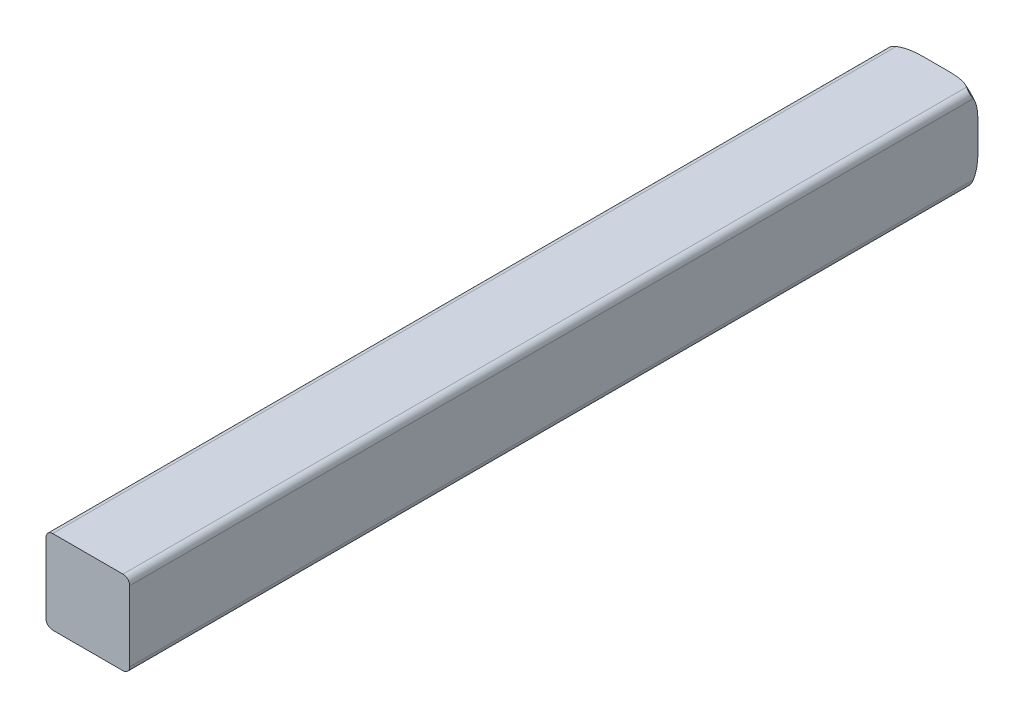
ISO-10303-21;
HEADER;
FILE_DESCRIPTION(('STEP AP214'),'2;1');
FILE_NAME('part.step','',(''),(''),'','','');
FILE_SCHEMA(('AUTOMOTIVE_DESIGN { 1 0 10303 214 1 1 1 1 }'));
ENDSEC;
DATA;
#1=APPLICATION_CONTEXT('core data for automotive mechanical design processes');
#2=APPLICATION_PROTOCOL_DEFINITION('international standard','automotive_design',2000,#1);
#3=PRODUCT_CONTEXT('',#1,'mechanical');
#4=PRODUCT('Part','Part','',(#3));
#5=PRODUCT_RELATED_PRODUCT_CATEGORY('part','',(#4));
#6=PRODUCT_DEFINITION_FORMATION('','',#4);
#7=PRODUCT_DEFINITION_CONTEXT('part definition',#1,'design');
#8=PRODUCT_DEFINITION('design','',#6,#7);
#9=PRODUCT_DEFINITION_SHAPE('','',#8);
#10=(LENGTH_UNIT() NAMED_UNIT(*) SI_UNIT(.MILLI.,.METRE.));
#11=(NAMED_UNIT(*) PLANE_ANGLE_UNIT() SI_UNIT($,.RADIAN.));
#12=(NAMED_UNIT(*) SI_UNIT($,.STERADIAN.) SOLID_ANGLE_UNIT());
#13=UNCERTAINTY_MEASURE_WITH_UNIT(LENGTH_MEASURE(1.E-05),#10,'distance_accuracy_value','');
#14=(GEOMETRIC_REPRESENTATION_CONTEXT(3) GLOBAL_UNCERTAINTY_ASSIGNED_CONTEXT((#13)) GLOBAL_UNIT_ASSIGNED_CONTEXT((#10,
#11,#12)) REPRESENTATION_CONTEXT('',''));
#15=CARTESIAN_POINT('',(0.,0.,0.));
#16=DIRECTION('',(0.,0.,1.));
#17=DIRECTION('',(1.,0.,0.));
#18=AXIS2_PLACEMENT_3D('',#15,#16,#17);
#19=CARTESIAN_POINT('',(-1.5875,1.5875,25.4));
#20=DIRECTION('',(0.,-1.,0.));
#21=DIRECTION('',(0.,0.,-1.));
#22=AXIS2_PLACEMENT_3D('',#19,#20,#21);
#23=PLANE('',#22);
#24=DIRECTION('',(-1.,0.,0.));
#25=VECTOR('',#24,1.);
#26=CARTESIAN_POINT('',(-1.5875,1.5875,6.7818));
#27=LINE('',#26,#25);
#28=CARTESIAN_POINT('',(1.33349999999987,1.5875,6.7818));
#29=VERTEX_POINT('',#28);
#30=CARTESIAN_POINT('',(-1.3335,1.5875,6.7818));
#31=VERTEX_POINT('',#30);
#32=EDGE_CURVE('E62',#29,#31,#27,.T.);
#33=ORIENTED_EDGE('',*,*,#32,.F.);
#34=DIRECTION('',(0.,0.,-1.));
#35=VECTOR('',#34,1.);
#36=CARTESIAN_POINT('',(1.3335,1.5875,25.4));
#37=LINE('',#36,#35);
#38=CARTESIAN_POINT('',(1.33349999999974,1.58749999999969,-25.2214993180163));
#39=VERTEX_POINT('',#38);
#40=EDGE_CURVE('E656',#29,#39,#37,.T.);
#41=ORIENTED_EDGE('',*,*,#40,.T.);
#42=CARTESIAN_POINT('',(0.377876338243537,1.5875,-25.4));
#43=CARTESIAN_POINT('',(0.426955428245409,1.58750000000001,-25.3999726994332));
#44=CARTESIAN_POINT('',(0.476057594365565,1.5875,-25.3996951238186));
#45=CARTESIAN_POINT('',(0.574418921693687,1.5875,-25.3977472425544));
#46=CARTESIAN_POINT('',(0.62367796087373,1.58749999999999,-25.3960715875607));
#47=CARTESIAN_POINT('',(0.723913767631209,1.58750000000001,-25.3903168861199));
#48=CARTESIAN_POINT('',(0.774886346404213,1.58750000000003,-25.3861508441119));
#49=CARTESIAN_POINT('',(0.876340123858613,1.58749999999998,-25.3741632283405));
#50=CARTESIAN_POINT('',(0.926821985170644,1.58749999999991,-25.3663475916038));
#51=CARTESIAN_POINT('',(1.03968865381837,1.58750000000012,-25.343126894308));
#52=CARTESIAN_POINT('',(1.10179917810948,1.58750000000048,-25.3262878050471));
#53=CARTESIAN_POINT('',(1.22173099315078,1.58749999999952,-25.2821772200221));
#54=CARTESIAN_POINT('',(1.27959244956708,1.58749999999822,-25.2550243715836));
#55=CARTESIAN_POINT('',(1.36359413549268,1.58749999999892,-25.202783804209));
#56=CARTESIAN_POINT('',(1.39245604351483,1.58749999999971,-25.1820824044844));
#57=CARTESIAN_POINT('',(1.44669209107436,1.58750000000029,-25.1364313876005));
#58=CARTESIAN_POINT('',(1.4720655765244,1.58750000000007,-25.1114809756997));
#59=CARTESIAN_POINT('',(1.51404623542894,1.58749999999994,-25.0620383759476));
#60=CARTESIAN_POINT('',(1.53141043958981,1.58749999999998,-25.0381925523342));
#61=CARTESIAN_POINT('',(1.56193958694738,1.58750000000002,-24.9879886721089));
#62=CARTESIAN_POINT('',(1.57511315347299,1.5875,-24.9616359213255));
#63=CARTESIAN_POINT('',(1.59654474779821,1.5875,-24.9068641092274));
#64=CARTESIAN_POINT('',(1.60478749941619,1.5875,-24.8784389293432));
#65=CARTESIAN_POINT('',(1.61299775211399,1.5875,-24.834926317523));
#66=CARTESIAN_POINT('',(1.61504186638972,1.5875,-24.8202074707068));
#67=CARTESIAN_POINT('',(1.61768666842858,1.5875,-24.7906311075223));
#68=CARTESIAN_POINT('',(1.61828640335517,1.5875,-24.7757735061027));
#69=CARTESIAN_POINT('',(1.61815024112135,1.5875,-24.7609129315498));
#70=B_SPLINE_CURVE_WITH_KNOTS('',3,(#42,#43,#44,#45,#46,#47,#48,#49,#50,#51,#52,#53,#54,#55,#56,
#57,#58,#59,#60,#61,#62,#63,#64,#65,#66,#67,#68,#69),.UNSPECIFIED.,.F.,.F.,(4,2,2,2,2,2,2,2,2,2,
2,2,2,4),(0.,0.147273115621917,0.295112327015831,0.448445203866136,0.601529508777507,
0.793946272313836,0.984213449531073,1.09043096758095,1.19666837457899,1.28480317220881,
1.37275541843134,1.46097875740129,1.50549646351195,1.55004352928615),.UNSPECIFIED.);
#71=CARTESIAN_POINT('',(0.377876338243537,1.5875,-25.4));
#72=VERTEX_POINT('',#71);
#73=EDGE_CURVE('E166',#72,#39,#70,.T.);
#74=ORIENTED_EDGE('',*,*,#73,.F.);
#75=DIRECTION('',(-1.,0.,0.));
#76=VECTOR('',#75,1.);
#77=CARTESIAN_POINT('',(-1.5875,1.5875,-25.4));
#78=LINE('',#77,#76);
#79=CARTESIAN_POINT('',(-0.377876338243537,1.5875,-25.4));
#80=VERTEX_POINT('',#79);
#81=EDGE_CURVE('E502',#80,#72,#78,.F.);
#82=ORIENTED_EDGE('',*,*,#81,.F.);
#83=CARTESIAN_POINT('',(-1.61815024112135,1.5875,-24.7609129315495));
#84=CARTESIAN_POINT('',(-1.61827741170984,1.5875,-24.774832975681));
#85=CARTESIAN_POINT('',(-1.61775944865016,1.5875,-24.788750955823));
#86=CARTESIAN_POINT('',(-1.61545341289209,1.5875,-24.8164742175458));
#87=CARTESIAN_POINT('',(-1.61366599695527,1.5875,-24.8302795536699));
#88=CARTESIAN_POINT('',(-1.60646537302774,1.5875,-24.8711787221652));
#89=CARTESIAN_POINT('',(-1.59921496550417,1.5875,-24.8979687703741));
#90=CARTESIAN_POINT('',(-1.58026897154028,1.5875,-24.9498408303818));
#91=CARTESIAN_POINT('',(-1.56858090771092,1.5875,-24.9749256484656));
#92=CARTESIAN_POINT('',(-1.54138158394458,1.5875,-25.0229615534635));
#93=CARTESIAN_POINT('',(-1.52586349761184,1.5875,-25.0459087286724));
#94=CARTESIAN_POINT('',(-1.48463218485366,1.5875,-25.0983024519879));
#95=CARTESIAN_POINT('',(-1.45735516065407,1.5875,-25.1265196838954));
#96=CARTESIAN_POINT('',(-1.39838558325937,1.5875,-25.1778013965824));
#97=CARTESIAN_POINT('',(-1.36668795214363,1.5875,-25.2008598710605));
#98=CARTESIAN_POINT('',(-1.28789122473977,1.5875,-25.2498632222909));
#99=CARTESIAN_POINT('',(-1.23946785559753,1.5875,-25.2736585940562));
#100=CARTESIAN_POINT('',(-1.13931384582846,1.5875,-25.3136496611643));
#101=CARTESIAN_POINT('',(-1.08756118289893,1.5875,-25.3297872004526));
#102=CARTESIAN_POINT('',(-0.980703284205731,1.5875,-25.3563774958481));
#103=CARTESIAN_POINT('',(-0.92554440435982,1.5875,-25.3666051089346));
#104=CARTESIAN_POINT('',(-0.814451345157166,1.5875,-25.3822387893676));
#105=CARTESIAN_POINT('',(-0.758515488325459,1.5875,-25.3876319037079));
#106=CARTESIAN_POINT('',(-0.648312937252075,1.5875,-25.3950507769004));
#107=CARTESIAN_POINT('',(-0.594052256949161,1.5875,-25.3971820558749));
#108=CARTESIAN_POINT('',(-0.48580696984646,1.5875,-25.3996317273539));
#109=CARTESIAN_POINT('',(-0.431822645610281,1.5875,-25.3999608515369));
#110=CARTESIAN_POINT('',(-0.377876338243536,1.5875,-25.4));
#111=B_SPLINE_CURVE_WITH_KNOTS('',3,(#83,#84,#85,#86,#87,#88,#89,#90,#91,#92,#93,#94,#95,#96,
#97,#98,#99,#100,#101,#102,#103,#104,#105,#106,#107,#108,#109,#110),.UNSPECIFIED.,.F.,.F.,(4,2,
2,2,2,2,2,2,2,2,2,2,2,4),(0.,0.0417318155340758,0.0834420564934037,0.166232897913919,
0.248884016362952,0.331683524563857,0.448675775655927,0.565803539136736,0.726767186975264,
0.888934420320442,1.05692964357109,1.22537364033489,1.38824385269957,1.55014312337862),.UNSPECIFIED.);
#112=CARTESIAN_POINT('',(-1.3335,1.5875,-25.2214993180159));
#113=VERTEX_POINT('',#112);
#114=EDGE_CURVE('E337',#113,#80,#111,.T.);
#115=ORIENTED_EDGE('',*,*,#114,.F.);
#116=DIRECTION('',(0.,0.,-1.));
#117=VECTOR('',#116,1.);
#118=CARTESIAN_POINT('',(-1.3335,1.5875,25.4));
#119=LINE('',#118,#117);
#120=EDGE_CURVE('E661',#113,#31,#119,.F.);
#121=ORIENTED_EDGE('',*,*,#120,.T.);
#122=EDGE_LOOP('',(#33,#41,#74,#82,#115,#121));
#123=FACE_BOUND('',#122,.T.);
#124=ADVANCED_FACE('F46',(#123),#23,.F.);
#125=CARTESIAN_POINT('',(1.5875,-1.5875,25.4));
#126=DIRECTION('',(-1.,0.,0.));
#127=DIRECTION('',(0.,0.,1.));
#128=AXIS2_PLACEMENT_3D('',#125,#126,#127);
#129=PLANE('',#128);
#130=DIRECTION('',(0.,1.,0.));
#131=VECTOR('',#130,1.);
#132=CARTESIAN_POINT('',(1.5875,-1.5875,6.7818));
#133=LINE('',#132,#131);
#134=CARTESIAN_POINT('',(1.5875,-1.33349999999987,6.7818));
#135=VERTEX_POINT('',#134);
#136=CARTESIAN_POINT('',(1.5875,1.3335,6.7818));
#137=VERTEX_POINT('',#136);
#138=EDGE_CURVE('E355',#135,#137,#133,.T.);
#139=ORIENTED_EDGE('',*,*,#138,.F.);
#140=DIRECTION('',(0.,0.,-1.));
#141=VECTOR('',#140,1.);
#142=CARTESIAN_POINT('',(1.5875,-1.3335,25.4));
#143=LINE('',#142,#141);
#144=CARTESIAN_POINT('',(1.58749999999969,-1.33349999999974,-25.2214993180163));
#145=VERTEX_POINT('',#144);
#146=EDGE_CURVE('E688',#135,#145,#143,.T.);
#147=ORIENTED_EDGE('',*,*,#146,.T.);
#148=CARTESIAN_POINT('',(1.5875,-0.377876338243537,-25.4));
#149=CARTESIAN_POINT('',(1.58750000000001,-0.426955428245409,-25.3999726994332));
#150=CARTESIAN_POINT('',(1.5875,-0.476057594365565,-25.3996951238186));
#151=CARTESIAN_POINT('',(1.5875,-0.574418921693687,-25.3977472425544));
#152=CARTESIAN_POINT('',(1.58749999999999,-0.62367796087373,-25.3960715875607));
#153=CARTESIAN_POINT('',(1.58750000000001,-0.723913767631209,-25.3903168861199));
#154=CARTESIAN_POINT('',(1.58750000000003,-0.774886346404213,-25.3861508441119));
#155=CARTESIAN_POINT('',(1.58749999999998,-0.876340123858612,-25.3741632283405));
#156=CARTESIAN_POINT('',(1.58749999999991,-0.926821985170644,-25.3663475916038));
#157=CARTESIAN_POINT('',(1.58750000000012,-1.03968865381837,-25.343126894308));
#158=CARTESIAN_POINT('',(1.58750000000048,-1.10179917810948,-25.3262878050471));
#159=CARTESIAN_POINT('',(1.58749999999952,-1.22173099315078,-25.2821772200221));
#160=CARTESIAN_POINT('',(1.58749999999822,-1.27959244956708,-25.2550243715836));
#161=CARTESIAN_POINT('',(1.58749999999892,-1.36359413549268,-25.202783804209));
#162=CARTESIAN_POINT('',(1.58749999999971,-1.39245604351483,-25.1820824044844));
#163=CARTESIAN_POINT('',(1.58750000000029,-1.44669209107436,-25.1364313876005));
#164=CARTESIAN_POINT('',(1.58750000000007,-1.4720655765244,-25.1114809756997));
#165=CARTESIAN_POINT('',(1.58749999999994,-1.51404623542894,-25.0620383759476));
#166=CARTESIAN_POINT('',(1.58749999999998,-1.53141043958981,-25.0381925523342));
#167=CARTESIAN_POINT('',(1.58750000000002,-1.56193958694738,-24.9879886721089));
#168=CARTESIAN_POINT('',(1.5875,-1.57511315347299,-24.9616359213255));
#169=CARTESIAN_POINT('',(1.5875,-1.59654474779821,-24.9068641092274));
#170=CARTESIAN_POINT('',(1.5875,-1.60478749941619,-24.8784389293432));
#171=CARTESIAN_POINT('',(1.5875,-1.61299775211399,-24.834926317523));
#172=CARTESIAN_POINT('',(1.5875,-1.61504186638972,-24.8202074707068));
#173=CARTESIAN_POINT('',(1.5875,-1.61768666842858,-24.7906311075223));
#174=CARTESIAN_POINT('',(1.5875,-1.61828640335517,-24.7757735061027));
#175=CARTESIAN_POINT('',(1.5875,-1.61815024112135,-24.7609129315498));
#176=B_SPLINE_CURVE_WITH_KNOTS('',3,(#148,#149,#150,#151,#152,#153,#154,#155,#156,#157,#158,
#159,#160,#161,#162,#163,#164,#165,#166,#167,#168,#169,#170,#171,#172,#173,#174,#175),
.UNSPECIFIED.,.F.,.F.,(4,2,2,2,2,2,2,2,2,2,2,2,2,4),(0.,0.147273115621916,0.295112327015831,
0.448445203866135,0.601529508777506,0.793946272313837,0.984213449531074,1.09043096758095,
1.19666837457899,1.28480317220881,1.37275541843134,1.46097875740129,1.50549646351195,
1.55004352928615),.UNSPECIFIED.);
#177=CARTESIAN_POINT('',(1.5875,-0.377876338243537,-25.4));
#178=VERTEX_POINT('',#177);
#179=EDGE_CURVE('E347',#178,#145,#176,.T.);
#180=ORIENTED_EDGE('',*,*,#179,.F.);
#181=DIRECTION('',(0.,1.,0.));
#182=VECTOR('',#181,1.);
#183=CARTESIAN_POINT('',(1.5875,1.5875,-25.4));
#184=LINE('',#183,#182);
#185=CARTESIAN_POINT('',(1.5875,0.377876338243537,-25.4));
#186=VERTEX_POINT('',#185);
#187=EDGE_CURVE('E486',#186,#178,#184,.F.);
#188=ORIENTED_EDGE('',*,*,#187,.F.);
#189=CARTESIAN_POINT('',(1.5875,1.61815024112135,-24.7609129315495));
#190=CARTESIAN_POINT('',(1.5875,1.61827741170984,-24.774832975681));
#191=CARTESIAN_POINT('',(1.5875,1.61775944865016,-24.788750955823));
#192=CARTESIAN_POINT('',(1.5875,1.61545341289209,-24.8164742175458));
#193=CARTESIAN_POINT('',(1.5875,1.61366599695527,-24.8302795536699));
#194=CARTESIAN_POINT('',(1.5875,1.60646537302775,-24.8711787221652));
#195=CARTESIAN_POINT('',(1.5875,1.59921496550417,-24.8979687703741));
#196=CARTESIAN_POINT('',(1.5875,1.58026897154028,-24.9498408303818));
#197=CARTESIAN_POINT('',(1.5875,1.56858090771092,-24.9749256484656));
#198=CARTESIAN_POINT('',(1.5875,1.54138158394458,-25.0229615534635));
#199=CARTESIAN_POINT('',(1.5875,1.52586349761184,-25.0459087286724));
#200=CARTESIAN_POINT('',(1.5875,1.48463218485365,-25.0983024519879));
#201=CARTESIAN_POINT('',(1.5875,1.45735516065407,-25.1265196838954));
#202=CARTESIAN_POINT('',(1.5875,1.39838558325937,-25.1778013965824));
#203=CARTESIAN_POINT('',(1.5875,1.36668795214363,-25.2008598710605));
#204=CARTESIAN_POINT('',(1.5875,1.28789122473977,-25.2498632222909));
#205=CARTESIAN_POINT('',(1.5875,1.23946785559753,-25.2736585940562));
#206=CARTESIAN_POINT('',(1.5875,1.13931384582846,-25.3136496611643));
#207=CARTESIAN_POINT('',(1.5875,1.08756118289893,-25.3297872004526));
#208=CARTESIAN_POINT('',(1.5875,0.980703284205732,-25.3563774958481));
#209=CARTESIAN_POINT('',(1.5875,0.925544404359821,-25.3666051089346));
#210=CARTESIAN_POINT('',(1.5875,0.814451345157166,-25.3822387893676));
#211=CARTESIAN_POINT('',(1.5875,0.758515488325458,-25.3876319037079));
#212=CARTESIAN_POINT('',(1.5875,0.648312937252075,-25.3950507769004));
#213=CARTESIAN_POINT('',(1.5875,0.594052256949161,-25.3971820558749));
#214=CARTESIAN_POINT('',(1.5875,0.48580696984646,-25.3996317273539));
#215=CARTESIAN_POINT('',(1.5875,0.431822645610281,-25.3999608515369));
#216=CARTESIAN_POINT('',(1.5875,0.377876338243536,-25.4));
#217=B_SPLINE_CURVE_WITH_KNOTS('',3,(#189,#190,#191,#192,#193,#194,#195,#196,#197,#198,#199,
#200,#201,#202,#203,#204,#205,#206,#207,#208,#209,#210,#211,#212,#213,#214,#215,#216),
.UNSPECIFIED.,.F.,.F.,(4,2,2,2,2,2,2,2,2,2,2,2,2,4),(0.,0.0417318155340758,0.0834420564934036,
0.166232897913923,0.248884016362952,0.331683524563858,0.44867577565593,0.565803539136736,
0.726767186975264,0.888934420320441,1.05692964357109,1.22537364033489,1.38824385269957,
1.55014312337862),.UNSPECIFIED.);
#218=CARTESIAN_POINT('',(1.5875,1.3335,-25.2214993180159));
#219=VERTEX_POINT('',#218);
#220=EDGE_CURVE('E162',#219,#186,#217,.T.);
#221=ORIENTED_EDGE('',*,*,#220,.F.);
#222=DIRECTION('',(0.,0.,-1.));
#223=VECTOR('',#222,1.);
#224=CARTESIAN_POINT('',(1.5875,1.3335,25.4));
#225=LINE('',#224,#223);
#226=EDGE_CURVE('E151',#219,#137,#225,.F.);
#227=ORIENTED_EDGE('',*,*,#226,.T.);
#228=EDGE_LOOP('',(#139,#147,#180,#188,#221,#227));
#229=FACE_BOUND('',#228,.T.);
#230=ADVANCED_FACE('F186',(#229),#129,.F.);
#231=CARTESIAN_POINT('',(-1.5875,-1.5875,25.4));
#232=DIRECTION('',(1.,0.,0.));
#233=DIRECTION('',(0.,0.,-1.));
#234=AXIS2_PLACEMENT_3D('',#231,#232,#233);
#235=PLANE('',#234);
#236=DIRECTION('',(0.,-1.,0.));
#237=VECTOR('',#236,1.);
#238=CARTESIAN_POINT('',(-1.5875,-1.5875,6.7818));
#239=LINE('',#238,#237);
#240=CARTESIAN_POINT('',(-1.5875,1.33349999999987,6.7818));
#241=VERTEX_POINT('',#240);
#242=CARTESIAN_POINT('',(-1.5875,-1.33349999999987,6.7818));
#243=VERTEX_POINT('',#242);
#244=EDGE_CURVE('E134',#241,#243,#239,.T.);
#245=ORIENTED_EDGE('',*,*,#244,.F.);
#246=DIRECTION('',(0.,0.,-1.));
#247=VECTOR('',#246,1.);
#248=CARTESIAN_POINT('',(-1.5875,1.3335,25.4));
#249=LINE('',#248,#247);
#250=CARTESIAN_POINT('',(-1.58749999999969,1.33349999999974,-25.2214993180163));
#251=VERTEX_POINT('',#250);
#252=EDGE_CURVE('E144',#241,#251,#249,.T.);
#253=ORIENTED_EDGE('',*,*,#252,.T.);
#254=CARTESIAN_POINT('',(-1.5875,0.377876338243537,-25.4));
#255=CARTESIAN_POINT('',(-1.58750000000001,0.426955428245409,-25.3999726994332));
#256=CARTESIAN_POINT('',(-1.5875,0.476057594365566,-25.3996951238186));
#257=CARTESIAN_POINT('',(-1.5875,0.574418921693688,-25.3977472425544));
#258=CARTESIAN_POINT('',(-1.58749999999999,0.623677960873731,-25.3960715875607));
#259=CARTESIAN_POINT('',(-1.58750000000001,0.72391376763121,-25.3903168861199));
#260=CARTESIAN_POINT('',(-1.58750000000003,0.774886346404214,-25.3861508441119));
#261=CARTESIAN_POINT('',(-1.58749999999998,0.876340123858614,-25.3741632283405));
#262=CARTESIAN_POINT('',(-1.58749999999991,0.926821985170646,-25.3663475916038));
#263=CARTESIAN_POINT('',(-1.58750000000012,1.03968865381837,-25.343126894308));
#264=CARTESIAN_POINT('',(-1.58750000000048,1.10179917810948,-25.3262878050471));
#265=CARTESIAN_POINT('',(-1.58749999999952,1.22173099315078,-25.2821772200221));
#266=CARTESIAN_POINT('',(-1.58749999999822,1.27959244956708,-25.2550243715836));
#267=CARTESIAN_POINT('',(-1.58749999999892,1.36359413549267,-25.202783804209));
#268=CARTESIAN_POINT('',(-1.58749999999971,1.39245604351483,-25.1820824044844));
#269=CARTESIAN_POINT('',(-1.58750000000029,1.44669209107436,-25.1364313876005));
#270=CARTESIAN_POINT('',(-1.58750000000007,1.4720655765244,-25.1114809756997));
#271=CARTESIAN_POINT('',(-1.58749999999994,1.51404623542894,-25.0620383759476));
#272=CARTESIAN_POINT('',(-1.58749999999998,1.53141043958981,-25.0381925523342));
#273=CARTESIAN_POINT('',(-1.58750000000002,1.56193958694738,-24.9879886721089));
#274=CARTESIAN_POINT('',(-1.5875,1.57511315347299,-24.9616359213255));
#275=CARTESIAN_POINT('',(-1.5875,1.59654474779821,-24.9068641092274));
#276=CARTESIAN_POINT('',(-1.5875,1.60478749941619,-24.8784389293432));
#277=CARTESIAN_POINT('',(-1.5875,1.61299775211399,-24.834926317523));
#278=CARTESIAN_POINT('',(-1.5875,1.61504186638972,-24.8202074707068));
#279=CARTESIAN_POINT('',(-1.5875,1.61768666842858,-24.7906311075223));
#280=CARTESIAN_POINT('',(-1.5875,1.61828640335517,-24.7757735061027));
#281=CARTESIAN_POINT('',(-1.5875,1.61815024112135,-24.7609129315498));
#282=B_SPLINE_CURVE_WITH_KNOTS('',3,(#254,#255,#256,#257,#258,#259,#260,#261,#262,#263,#264,
#265,#266,#267,#268,#269,#270,#271,#272,#273,#274,#275,#276,#277,#278,#279,#280,#281),
.UNSPECIFIED.,.F.,.F.,(4,2,2,2,2,2,2,2,2,2,2,2,2,4),(0.,0.147273115621917,0.295112327015832,
0.448445203866137,0.601529508777508,0.793946272313836,0.984213449531072,1.09043096758095,
1.19666837457899,1.28480317220881,1.37275541843134,1.46097875740129,1.50549646351195,
1.55004352928615),.UNSPECIFIED.);
#283=CARTESIAN_POINT('',(-1.5875,0.377876338243537,-25.4));
#284=VERTEX_POINT('',#283);
#285=EDGE_CURVE('E183',#284,#251,#282,.T.);
#286=ORIENTED_EDGE('',*,*,#285,.F.);
#287=DIRECTION('',(0.,1.,0.));
#288=VECTOR('',#287,1.);
#289=CARTESIAN_POINT('',(-1.5875,1.5875,-25.4));
#290=LINE('',#289,#288);
#291=CARTESIAN_POINT('',(-1.5875,-0.377876338243537,-25.4));
#292=VERTEX_POINT('',#291);
#293=EDGE_CURVE('E503',#292,#284,#290,.T.);
#294=ORIENTED_EDGE('',*,*,#293,.F.);
#295=CARTESIAN_POINT('',(-1.5875,-1.61815024112135,-24.7609129315495));
#296=CARTESIAN_POINT('',(-1.5875,-1.61827741170984,-24.774832975681));
#297=CARTESIAN_POINT('',(-1.5875,-1.61775944865016,-24.788750955823));
#298=CARTESIAN_POINT('',(-1.5875,-1.61545341289209,-24.8164742175458));
#299=CARTESIAN_POINT('',(-1.5875,-1.61366599695527,-24.8302795536699));
#300=CARTESIAN_POINT('',(-1.5875,-1.60646537302775,-24.8711787221652));
#301=CARTESIAN_POINT('',(-1.5875,-1.59921496550417,-24.8979687703741));
#302=CARTESIAN_POINT('',(-1.5875,-1.58026897154029,-24.9498408303818));
#303=CARTESIAN_POINT('',(-1.5875,-1.56858090771093,-24.9749256484655));
#304=CARTESIAN_POINT('',(-1.5875,-1.54138158394458,-25.0229615534635));
#305=CARTESIAN_POINT('',(-1.5875,-1.52586349761185,-25.0459087286724));
#306=CARTESIAN_POINT('',(-1.5875,-1.48463218485366,-25.0983024519879));
#307=CARTESIAN_POINT('',(-1.5875,-1.45735516065408,-25.1265196838954));
#308=CARTESIAN_POINT('',(-1.5875,-1.39838558325937,-25.1778013965824));
#309=CARTESIAN_POINT('',(-1.5875,-1.36668795214363,-25.2008598710605));
#310=CARTESIAN_POINT('',(-1.5875,-1.28789122473977,-25.2498632222909));
#311=CARTESIAN_POINT('',(-1.5875,-1.23946785559753,-25.2736585940562));
#312=CARTESIAN_POINT('',(-1.5875,-1.13931384582846,-25.3136496611643));
#313=CARTESIAN_POINT('',(-1.5875,-1.08756118289893,-25.3297872004526));
#314=CARTESIAN_POINT('',(-1.5875,-0.980703284205731,-25.3563774958481));
#315=CARTESIAN_POINT('',(-1.5875,-0.925544404359821,-25.3666051089346));
#316=CARTESIAN_POINT('',(-1.5875,-0.814451345157166,-25.3822387893676));
#317=CARTESIAN_POINT('',(-1.5875,-0.758515488325459,-25.3876319037079));
#318=CARTESIAN_POINT('',(-1.5875,-0.648312937252075,-25.3950507769004));
#319=CARTESIAN_POINT('',(-1.5875,-0.594052256949161,-25.3971820558749));
#320=CARTESIAN_POINT('',(-1.5875,-0.48580696984646,-25.3996317273539));
#321=CARTESIAN_POINT('',(-1.5875,-0.431822645610281,-25.3999608515369));
#322=CARTESIAN_POINT('',(-1.5875,-0.377876338243537,-25.4));
#323=B_SPLINE_CURVE_WITH_KNOTS('',3,(#295,#296,#297,#298,#299,#300,#301,#302,#303,#304,#305,
#306,#307,#308,#309,#310,#311,#312,#313,#314,#315,#316,#317,#318,#319,#320,#321,#322),
.UNSPECIFIED.,.F.,.F.,(4,2,2,2,2,2,2,2,2,2,2,2,2,4),(0.,0.0417318155340758,0.0834420564934035,
0.166232897913919,0.248884016362948,0.331683524563856,0.448675775655931,0.565803539136743,
0.726767186975271,0.888934420320449,1.0569296435711,1.2253736403349,1.38824385269958,
1.55014312337863),.UNSPECIFIED.);
#324=CARTESIAN_POINT('',(-1.5875,-1.3335,-25.2214993180159));
#325=VERTEX_POINT('',#324);
#326=EDGE_CURVE('E335',#325,#292,#323,.T.);
#327=ORIENTED_EDGE('',*,*,#326,.F.);
#328=DIRECTION('',(0.,0.,-1.));
#329=VECTOR('',#328,1.);
#330=CARTESIAN_POINT('',(-1.5875,-1.3335,25.4));
#331=LINE('',#330,#329);
#332=EDGE_CURVE('E147',#325,#243,#331,.F.);
#333=ORIENTED_EDGE('',*,*,#332,.T.);
#334=EDGE_LOOP('',(#245,#253,#286,#294,#327,#333));
#335=FACE_BOUND('',#334,.T.);
#336=ADVANCED_FACE('F142',(#335),#235,.F.);
#337=CARTESIAN_POINT('',(-1.5875,-1.5875,25.4));
#338=DIRECTION('',(0.,1.,0.));
#339=DIRECTION('',(0.,0.,1.));
#340=AXIS2_PLACEMENT_3D('',#337,#338,#339);
#341=PLANE('',#340);
#342=DIRECTION('',(1.,0.,0.));
#343=VECTOR('',#342,1.);
#344=CARTESIAN_POINT('',(-1.5875,-1.5875,6.7818));
#345=LINE('',#344,#343);
#346=CARTESIAN_POINT('',(-1.33349999999987,-1.5875,6.7818));
#347=VERTEX_POINT('',#346);
#348=CARTESIAN_POINT('',(1.33349999999987,-1.5875,6.7818));
#349=VERTEX_POINT('',#348);
#350=EDGE_CURVE('E693',#347,#349,#345,.T.);
#351=ORIENTED_EDGE('',*,*,#350,.F.);
#352=DIRECTION('',(0.,0.,-1.));
#353=VECTOR('',#352,1.);
#354=CARTESIAN_POINT('',(-1.3335,-1.5875,25.4));
#355=LINE('',#354,#353);
#356=CARTESIAN_POINT('',(-1.33349999999974,-1.58749999999969,-25.2214993180163));
#357=VERTEX_POINT('',#356);
#358=EDGE_CURVE('E153',#347,#357,#355,.T.);
#359=ORIENTED_EDGE('',*,*,#358,.T.);
#360=CARTESIAN_POINT('',(-0.377876338243537,-1.5875,-25.4));
#361=CARTESIAN_POINT('',(-0.426955428245409,-1.58750000000001,-25.3999726994332));
#362=CARTESIAN_POINT('',(-0.476057594365565,-1.5875,-25.3996951238186));
#363=CARTESIAN_POINT('',(-0.574418921693686,-1.5875,-25.3977472425544));
#364=CARTESIAN_POINT('',(-0.623677960873729,-1.58749999999999,-25.3960715875607));
#365=CARTESIAN_POINT('',(-0.723913767631208,-1.58750000000001,-25.3903168861199));
#366=CARTESIAN_POINT('',(-0.774886346404213,-1.58750000000003,-25.3861508441119));
#367=CARTESIAN_POINT('',(-0.876340123858612,-1.58749999999998,-25.3741632283405));
#368=CARTESIAN_POINT('',(-0.926821985170644,-1.58749999999991,-25.3663475916038));
#369=CARTESIAN_POINT('',(-1.03968865381837,-1.58750000000012,-25.343126894308));
#370=CARTESIAN_POINT('',(-1.10179917810948,-1.58750000000048,-25.3262878050471));
#371=CARTESIAN_POINT('',(-1.22173099315078,-1.58749999999952,-25.2821772200221));
#372=CARTESIAN_POINT('',(-1.27959244956708,-1.58749999999822,-25.2550243715836));
#373=CARTESIAN_POINT('',(-1.36359413549268,-1.58749999999892,-25.202783804209));
#374=CARTESIAN_POINT('',(-1.39245604351483,-1.58749999999971,-25.1820824044844));
#375=CARTESIAN_POINT('',(-1.44669209107436,-1.58750000000029,-25.1364313876005));
#376=CARTESIAN_POINT('',(-1.4720655765244,-1.58750000000007,-25.1114809756997));
#377=CARTESIAN_POINT('',(-1.51404623542894,-1.58749999999994,-25.0620383759476));
#378=CARTESIAN_POINT('',(-1.53141043958981,-1.58749999999998,-25.0381925523342));
#379=CARTESIAN_POINT('',(-1.56193958694738,-1.58750000000002,-24.9879886721089));
#380=CARTESIAN_POINT('',(-1.57511315347299,-1.5875,-24.9616359213255));
#381=CARTESIAN_POINT('',(-1.59654474779821,-1.5875,-24.9068641092274));
#382=CARTESIAN_POINT('',(-1.60478749941619,-1.5875,-24.8784389293432));
#383=CARTESIAN_POINT('',(-1.61299775211399,-1.5875,-24.834926317523));
#384=CARTESIAN_POINT('',(-1.61504186638972,-1.5875,-24.8202074707068));
#385=CARTESIAN_POINT('',(-1.61768666842858,-1.5875,-24.7906311075223));
#386=CARTESIAN_POINT('',(-1.61828640335517,-1.5875,-24.7757735061027));
#387=CARTESIAN_POINT('',(-1.61815024112135,-1.5875,-24.7609129315498));
#388=B_SPLINE_CURVE_WITH_KNOTS('',3,(#360,#361,#362,#363,#364,#365,#366,#367,#368,#369,#370,
#371,#372,#373,#374,#375,#376,#377,#378,#379,#380,#381,#382,#383,#384,#385,#386,#387),
.UNSPECIFIED.,.F.,.F.,(4,2,2,2,2,2,2,2,2,2,2,2,2,4),(0.,0.147273115621916,0.29511232701583,
0.448445203866135,0.601529508777506,0.793946272313837,0.984213449531074,1.09043096758095,
1.19666837457899,1.28480317220881,1.37275541843135,1.46097875740129,1.50549646351196,
1.55004352928616),.UNSPECIFIED.);
#389=CARTESIAN_POINT('',(-0.377876338243537,-1.5875,-25.4));
#390=VERTEX_POINT('',#389);
#391=EDGE_CURVE('E270',#390,#357,#388,.T.);
#392=ORIENTED_EDGE('',*,*,#391,.F.);
#393=DIRECTION('',(-1.,0.,0.));
#394=VECTOR('',#393,1.);
#395=CARTESIAN_POINT('',(-1.5875,-1.5875,-25.4));
#396=LINE('',#395,#394);
#397=CARTESIAN_POINT('',(0.377876338243536,-1.5875,-25.4));
#398=VERTEX_POINT('',#397);
#399=EDGE_CURVE('E484',#398,#390,#396,.T.);
#400=ORIENTED_EDGE('',*,*,#399,.F.);
#401=CARTESIAN_POINT('',(1.61815024112135,-1.5875,-24.7609129315495));
#402=CARTESIAN_POINT('',(1.61827741170984,-1.5875,-24.7748329756809));
#403=CARTESIAN_POINT('',(1.61775944865016,-1.5875,-24.788750955823));
#404=CARTESIAN_POINT('',(1.61545341289209,-1.5875,-24.8164742175458));
#405=CARTESIAN_POINT('',(1.61366599695527,-1.5875,-24.8302795536699));
#406=CARTESIAN_POINT('',(1.60646537302775,-1.5875,-24.8711787221652));
#407=CARTESIAN_POINT('',(1.59921496550418,-1.5875,-24.8979687703741));
#408=CARTESIAN_POINT('',(1.58026897154029,-1.5875,-24.9498408303818));
#409=CARTESIAN_POINT('',(1.56858090771093,-1.5875,-24.9749256484656));
#410=CARTESIAN_POINT('',(1.54138158394458,-1.5875,-25.0229615534635));
#411=CARTESIAN_POINT('',(1.52586349761185,-1.5875,-25.0459087286724));
#412=CARTESIAN_POINT('',(1.48463218485366,-1.5875,-25.0983024519879));
#413=CARTESIAN_POINT('',(1.45735516065408,-1.5875,-25.1265196838954));
#414=CARTESIAN_POINT('',(1.39838558325937,-1.5875,-25.1778013965823));
#415=CARTESIAN_POINT('',(1.36668795214363,-1.5875,-25.2008598710605));
#416=CARTESIAN_POINT('',(1.28789122473977,-1.5875,-25.2498632222909));
#417=CARTESIAN_POINT('',(1.23946785559753,-1.5875,-25.2736585940562));
#418=CARTESIAN_POINT('',(1.13931384582846,-1.5875,-25.3136496611643));
#419=CARTESIAN_POINT('',(1.08756118289892,-1.5875,-25.3297872004526));
#420=CARTESIAN_POINT('',(0.98070328420573,-1.5875,-25.3563774958481));
#421=CARTESIAN_POINT('',(0.92554440435982,-1.5875,-25.3666051089346));
#422=CARTESIAN_POINT('',(0.814451345157165,-1.5875,-25.3822387893676));
#423=CARTESIAN_POINT('',(0.758515488325458,-1.5875,-25.3876319037079));
#424=CARTESIAN_POINT('',(0.648312937252074,-1.5875,-25.3950507769004));
#425=CARTESIAN_POINT('',(0.59405225694916,-1.5875,-25.3971820558749));
#426=CARTESIAN_POINT('',(0.48580696984646,-1.5875,-25.3996317273539));
#427=CARTESIAN_POINT('',(0.431822645610281,-1.5875,-25.3999608515369));
#428=CARTESIAN_POINT('',(0.377876338243536,-1.5875,-25.4));
#429=B_SPLINE_CURVE_WITH_KNOTS('',3,(#401,#402,#403,#404,#405,#406,#407,#408,#409,#410,#411,
#412,#413,#414,#415,#416,#417,#418,#419,#420,#421,#422,#423,#424,#425,#426,#427,#428),
.UNSPECIFIED.,.F.,.F.,(4,2,2,2,2,2,2,2,2,2,2,2,2,4),(0.,0.0417318155340723,0.0834420564934033,
0.166232897913922,0.248884016362954,0.33168352456386,0.448675775655933,0.565803539136746,
0.726767186975275,0.888934420320453,1.0569296435711,1.2253736403349,1.38824385269958,
1.55014312337863),.UNSPECIFIED.);
#430=CARTESIAN_POINT('',(1.3335,-1.5875,-25.2214993180159));
#431=VERTEX_POINT('',#430);
#432=EDGE_CURVE('E332',#431,#398,#429,.T.);
#433=ORIENTED_EDGE('',*,*,#432,.F.);
#434=DIRECTION('',(0.,0.,-1.));
#435=VECTOR('',#434,1.);
#436=CARTESIAN_POINT('',(1.3335,-1.5875,25.4));
#437=LINE('',#436,#435);
#438=EDGE_CURVE('E317',#431,#349,#437,.F.);
#439=ORIENTED_EDGE('',*,*,#438,.T.);
#440=EDGE_LOOP('',(#351,#359,#392,#400,#433,#439));
#441=FACE_BOUND('',#440,.T.);
#442=ADVANCED_FACE('F391',(#441),#341,.F.);
#443=CARTESIAN_POINT('',(-1.3335,-1.3335,25.4));
#444=DIRECTION('',(0.,0.,-1.));
#445=DIRECTION('',(-1.,0.,0.));
#446=AXIS2_PLACEMENT_3D('',#443,#444,#445);
#447=CYLINDRICAL_SURFACE('',#446,0.254);
#448=ORIENTED_EDGE('',*,*,#358,.F.);
#449=CARTESIAN_POINT('',(-1.3335,-1.3335,6.7818));
#450=DIRECTION('',(0.,0.,1.));
#451=DIRECTION('',(1.,0.,0.));
#452=AXIS2_PLACEMENT_3D('',#449,#450,#451);
#453=CIRCLE('',#452,0.254);
#454=EDGE_CURVE('E697',#347,#243,#453,.F.);
#455=ORIENTED_EDGE('',*,*,#454,.T.);
#456=ORIENTED_EDGE('',*,*,#332,.F.);
#457=CARTESIAN_POINT('',(-1.33349999999987,-1.58749999999985,-25.2214993180165));
#458=CARTESIAN_POINT('',(-1.3469079246289,-1.58748566897284,-25.2131902383447));
#459=CARTESIAN_POINT('',(-1.3604626863625,-1.58643563491716,-25.2049732030895));
#460=CARTESIAN_POINT('',(-1.3878383849123,-1.58201648662526,-25.1892469870889));
#461=CARTESIAN_POINT('',(-1.40166046367832,-1.57861670279283,-25.1817486789985));
#462=CARTESIAN_POINT('',(-1.4252188046147,-1.570587142209,-25.1701813537227));
#463=CARTESIAN_POINT('',(-1.43498690476726,-1.56659229292948,-25.1657462781292));
#464=CARTESIAN_POINT('',(-1.45425932377607,-1.55721249958352,-25.1580014330523));
#465=CARTESIAN_POINT('',(-1.46376466264452,-1.55183414419054,-25.1546864976667));
#466=CARTESIAN_POINT('',(-1.48078992954882,-1.54064277647381,-25.1499494031102));
#467=CARTESIAN_POINT('',(-1.48838416094874,-1.53503704758624,-25.1483092418591));
#468=CARTESIAN_POINT('',(-1.50299443314621,-1.52291375209385,-25.1462529778718));
#469=CARTESIAN_POINT('',(-1.51001060875288,-1.51639639905198,-25.1458365889481));
#470=CARTESIAN_POINT('',(-1.52324184577933,-1.50263078678945,-25.1462804295973));
#471=CARTESIAN_POINT('',(-1.5294566739799,-1.49538231587773,-25.1471410299099));
#472=CARTESIAN_POINT('',(-1.54093535352856,-1.48038761855597,-25.1500339763629));
#473=CARTESIAN_POINT('',(-1.54619862694717,-1.47264109349694,-25.1520670314777));
#474=CARTESIAN_POINT('',(-1.55717012811805,-1.45446300659173,-25.157864814596));
#475=CARTESIAN_POINT('',(-1.5625287509159,-1.44392996611584,-25.1619678064679));
#476=CARTESIAN_POINT('',(-1.57162418246103,-1.42264994892341,-25.1713367713513));
#477=CARTESIAN_POINT('',(-1.57535394035412,-1.41190224866791,-25.1766076544231));
#478=CARTESIAN_POINT('',(-1.58147222213896,-1.38976321513493,-25.1882192454683));
#479=CARTESIAN_POINT('',(-1.58376977522871,-1.37837092259137,-25.1946044346478));
#480=CARTESIAN_POINT('',(-1.58677095199112,-1.35579141019536,-25.2078013248425));
#481=CARTESIAN_POINT('',(-1.58749208945789,-1.34460332096516,-25.2146074664251));
#482=CARTESIAN_POINT('',(-1.5875,-1.3335,-25.2214993180159));
#483=B_SPLINE_CURVE_WITH_KNOTS('',3,(#457,#458,#459,#460,#461,#462,#463,#464,#465,#466,#467,
#468,#469,#470,#471,#472,#473,#474,#475,#476,#477,#478,#479,#480,#481,#482),.UNSPECIFIED.,.F.,
.F.,(4,2,2,2,2,2,2,2,2,2,2,2,4),(0.,0.0474135575384639,0.0954579548323003,0.129685196647983,
0.163752362077672,0.192367952546462,0.220976850535105,0.249594055978292,0.278228584197096,
0.315551990426988,0.353035394369526,0.392706187180973,0.43193395327091),.UNSPECIFIED.);
#484=EDGE_CURVE('E149',#357,#325,#483,.T.);
#485=ORIENTED_EDGE('',*,*,#484,.F.);
#486=EDGE_LOOP('',(#448,#455,#456,#485));
#487=FACE_BOUND('',#486,.T.);
#488=ADVANCED_FACE('F395',(#487),#447,.T.);
#489=CARTESIAN_POINT('',(1.3335,-1.3335,25.4));
#490=DIRECTION('',(0.,0.,-1.));
#491=DIRECTION('',(-1.,0.,0.));
#492=AXIS2_PLACEMENT_3D('',#489,#490,#491);
#493=CYLINDRICAL_SURFACE('',#492,0.254);
#494=ORIENTED_EDGE('',*,*,#146,.F.);
#495=CARTESIAN_POINT('',(1.3335,-1.3335,6.7818));
#496=DIRECTION('',(0.,0.,1.));
#497=DIRECTION('',(1.,0.,0.));
#498=AXIS2_PLACEMENT_3D('',#495,#496,#497);
#499=CIRCLE('',#498,0.254);
#500=EDGE_CURVE('E204',#135,#349,#499,.F.);
#501=ORIENTED_EDGE('',*,*,#500,.T.);
#502=ORIENTED_EDGE('',*,*,#438,.F.);
#503=CARTESIAN_POINT('',(1.58749999999985,-1.33349999999987,-25.2214993180165));
#504=CARTESIAN_POINT('',(1.58748566897285,-1.3469079246289,-25.2131902383447));
#505=CARTESIAN_POINT('',(1.58643563491716,-1.3604626863625,-25.2049732030895));
#506=CARTESIAN_POINT('',(1.58201648662526,-1.3878383849123,-25.1892469870889));
#507=CARTESIAN_POINT('',(1.57861670279283,-1.40166046367832,-25.1817486789985));
#508=CARTESIAN_POINT('',(1.570587142209,-1.4252188046147,-25.1701813537227));
#509=CARTESIAN_POINT('',(1.56659229292948,-1.43498690476726,-25.1657462781292));
#510=CARTESIAN_POINT('',(1.55721249958352,-1.45425932377607,-25.1580014330523));
#511=CARTESIAN_POINT('',(1.55183414419054,-1.46376466264452,-25.1546864976667));
#512=CARTESIAN_POINT('',(1.54064277647381,-1.48078992954882,-25.1499494031102));
#513=CARTESIAN_POINT('',(1.53503704758624,-1.48838416094874,-25.1483092418591));
#514=CARTESIAN_POINT('',(1.52291375209385,-1.50299443314621,-25.1462529778718));
#515=CARTESIAN_POINT('',(1.51639639905198,-1.51001060875288,-25.1458365889481));
#516=CARTESIAN_POINT('',(1.50263078678945,-1.52324184577933,-25.1462804295973));
#517=CARTESIAN_POINT('',(1.49538231587773,-1.5294566739799,-25.1471410299099));
#518=CARTESIAN_POINT('',(1.48038761855597,-1.54093535352856,-25.1500339763629));
#519=CARTESIAN_POINT('',(1.47264109349694,-1.54619862694717,-25.1520670314777));
#520=CARTESIAN_POINT('',(1.45446300659173,-1.55717012811805,-25.157864814596));
#521=CARTESIAN_POINT('',(1.44392996611584,-1.5625287509159,-25.1619678064679));
#522=CARTESIAN_POINT('',(1.42264994892341,-1.57162418246103,-25.1713367713513));
#523=CARTESIAN_POINT('',(1.41190224866791,-1.57535394035412,-25.1766076544231));
#524=CARTESIAN_POINT('',(1.38976321513493,-1.58147222213896,-25.1882192454683));
#525=CARTESIAN_POINT('',(1.37837092259136,-1.58376977522871,-25.1946044346478));
#526=CARTESIAN_POINT('',(1.35579141019535,-1.58677095199112,-25.2078013248425));
#527=CARTESIAN_POINT('',(1.34460332096516,-1.58749208945789,-25.2146074664251));
#528=CARTESIAN_POINT('',(1.3335,-1.5875,-25.2214993180159));
#529=B_SPLINE_CURVE_WITH_KNOTS('',3,(#503,#504,#505,#506,#507,#508,#509,#510,#511,#512,#513,
#514,#515,#516,#517,#518,#519,#520,#521,#522,#523,#524,#525,#526,#527,#528),.UNSPECIFIED.,.F.,
.F.,(4,2,2,2,2,2,2,2,2,2,2,2,4),(0.,0.0474135575384631,0.0954579548322985,0.129685196647981,
0.16375236207767,0.19236795254646,0.220976850535104,0.249594055978291,0.278228584197096,
0.315551990426988,0.353035394369527,0.392706187180975,0.43193395327091),.UNSPECIFIED.);
#530=EDGE_CURVE('E684',#145,#431,#529,.T.);
#531=ORIENTED_EDGE('',*,*,#530,.F.);
#532=EDGE_LOOP('',(#494,#501,#502,#531));
#533=FACE_BOUND('',#532,.T.);
#534=ADVANCED_FACE('F678',(#533),#493,.T.);
#535=CARTESIAN_POINT('',(1.3335,1.3335,25.4));
#536=DIRECTION('',(0.,0.,-1.));
#537=DIRECTION('',(-1.,0.,0.));
#538=AXIS2_PLACEMENT_3D('',#535,#536,#537);
#539=CYLINDRICAL_SURFACE('',#538,0.254);
#540=ORIENTED_EDGE('',*,*,#40,.F.);
#541=CARTESIAN_POINT('',(1.3335,1.3335,6.7818));
#542=DIRECTION('',(0.,0.,1.));
#543=DIRECTION('',(1.,0.,0.));
#544=AXIS2_PLACEMENT_3D('',#541,#542,#543);
#545=CIRCLE('',#544,0.254);
#546=EDGE_CURVE('E698',#29,#137,#545,.F.);
#547=ORIENTED_EDGE('',*,*,#546,.T.);
#548=ORIENTED_EDGE('',*,*,#226,.F.);
#549=CARTESIAN_POINT('',(1.33349999999987,1.58749999999985,-25.2214993180165));
#550=CARTESIAN_POINT('',(1.3469079246289,1.58748566897285,-25.2131902383447));
#551=CARTESIAN_POINT('',(1.3604626863625,1.58643563491716,-25.2049732030895));
#552=CARTESIAN_POINT('',(1.3878383849123,1.58201648662526,-25.1892469870889));
#553=CARTESIAN_POINT('',(1.40166046367832,1.57861670279283,-25.1817486789985));
#554=CARTESIAN_POINT('',(1.4252188046147,1.570587142209,-25.1701813537227));
#555=CARTESIAN_POINT('',(1.43498690476726,1.56659229292948,-25.1657462781292));
#556=CARTESIAN_POINT('',(1.45425932377607,1.55721249958352,-25.1580014330523));
#557=CARTESIAN_POINT('',(1.46376466264452,1.55183414419054,-25.1546864976667));
#558=CARTESIAN_POINT('',(1.48078992954882,1.54064277647381,-25.1499494031102));
#559=CARTESIAN_POINT('',(1.48838416094874,1.53503704758624,-25.1483092418591));
#560=CARTESIAN_POINT('',(1.50299443314621,1.52291375209385,-25.1462529778718));
#561=CARTESIAN_POINT('',(1.51001060875288,1.51639639905198,-25.1458365889481));
#562=CARTESIAN_POINT('',(1.52324184577933,1.50263078678945,-25.1462804295973));
#563=CARTESIAN_POINT('',(1.52945667397989,1.49538231587773,-25.1471410299099));
#564=CARTESIAN_POINT('',(1.54093535352856,1.48038761855597,-25.1500339763629));
#565=CARTESIAN_POINT('',(1.54619862694717,1.47264109349694,-25.1520670314777));
#566=CARTESIAN_POINT('',(1.55717012811805,1.45446300659173,-25.157864814596));
#567=CARTESIAN_POINT('',(1.5625287509159,1.44392996611584,-25.1619678064679));
#568=CARTESIAN_POINT('',(1.57162418246102,1.42264994892341,-25.1713367713513));
#569=CARTESIAN_POINT('',(1.57535394035412,1.41190224866791,-25.1766076544231));
#570=CARTESIAN_POINT('',(1.58147222213896,1.38976321513493,-25.1882192454683));
#571=CARTESIAN_POINT('',(1.58376977522871,1.37837092259137,-25.1946044346478));
#572=CARTESIAN_POINT('',(1.58677095199112,1.35579141019536,-25.2078013248425));
#573=CARTESIAN_POINT('',(1.58749208945789,1.34460332096516,-25.2146074664251));
#574=CARTESIAN_POINT('',(1.5875,1.3335,-25.2214993180159));
#575=B_SPLINE_CURVE_WITH_KNOTS('',3,(#549,#550,#551,#552,#553,#554,#555,#556,#557,#558,#559,
#560,#561,#562,#563,#564,#565,#566,#567,#568,#569,#570,#571,#572,#573,#574),.UNSPECIFIED.,.F.,
.F.,(4,2,2,2,2,2,2,2,2,2,2,2,4),(0.,0.0474135575384645,0.0954579548323013,0.129685196647983,
0.163752362077671,0.192367952546461,0.220976850535104,0.249594055978291,0.278228584197096,
0.315551990426988,0.353035394369525,0.392706187180973,0.43193395327091),.UNSPECIFIED.);
#576=EDGE_CURVE('E660',#39,#219,#575,.T.);
#577=ORIENTED_EDGE('',*,*,#576,.F.);
#578=EDGE_LOOP('',(#540,#547,#548,#577));
#579=FACE_BOUND('',#578,.T.);
#580=ADVANCED_FACE('F664',(#579),#539,.T.);
#581=CARTESIAN_POINT('',(-1.3335,1.3335,25.4));
#582=DIRECTION('',(0.,0.,-1.));
#583=DIRECTION('',(-1.,0.,0.));
#584=AXIS2_PLACEMENT_3D('',#581,#582,#583);
#585=CYLINDRICAL_SURFACE('',#584,0.254);
#586=ORIENTED_EDGE('',*,*,#252,.F.);
#587=CARTESIAN_POINT('',(-1.3335,1.3335,6.7818));
#588=DIRECTION('',(0.,0.,1.));
#589=DIRECTION('',(1.,0.,0.));
#590=AXIS2_PLACEMENT_3D('',#587,#588,#589);
#591=CIRCLE('',#590,0.254);
#592=EDGE_CURVE('E13',#241,#31,#591,.F.);
#593=ORIENTED_EDGE('',*,*,#592,.T.);
#594=ORIENTED_EDGE('',*,*,#120,.F.);
#595=CARTESIAN_POINT('',(-1.58749999999985,1.33349999999987,-25.2214993180165));
#596=CARTESIAN_POINT('',(-1.58748566897284,1.3469079246289,-25.2131902383447));
#597=CARTESIAN_POINT('',(-1.58643563491716,1.3604626863625,-25.2049732030895));
#598=CARTESIAN_POINT('',(-1.58201648662526,1.3878383849123,-25.1892469870889));
#599=CARTESIAN_POINT('',(-1.57861670279283,1.40166046367832,-25.1817486789985));
#600=CARTESIAN_POINT('',(-1.570587142209,1.4252188046147,-25.1701813537227));
#601=CARTESIAN_POINT('',(-1.56659229292948,1.43498690476726,-25.1657462781292));
#602=CARTESIAN_POINT('',(-1.55721249958352,1.45425932377607,-25.1580014330523));
#603=CARTESIAN_POINT('',(-1.55183414419054,1.46376466264451,-25.1546864976667));
#604=CARTESIAN_POINT('',(-1.54064277647381,1.48078992954882,-25.1499494031102));
#605=CARTESIAN_POINT('',(-1.53503704758624,1.48838416094874,-25.1483092418591));
#606=CARTESIAN_POINT('',(-1.52291375209385,1.50299443314621,-25.1462529778718));
#607=CARTESIAN_POINT('',(-1.51639639905198,1.51001060875288,-25.1458365889481));
#608=CARTESIAN_POINT('',(-1.50263078678945,1.52324184577933,-25.1462804295973));
#609=CARTESIAN_POINT('',(-1.49538231587773,1.52945667397989,-25.1471410299099));
#610=CARTESIAN_POINT('',(-1.48038761855597,1.54093535352856,-25.1500339763629));
#611=CARTESIAN_POINT('',(-1.47264109349694,1.54619862694716,-25.1520670314777));
#612=CARTESIAN_POINT('',(-1.45446300659173,1.55717012811805,-25.157864814596));
#613=CARTESIAN_POINT('',(-1.44392996611584,1.5625287509159,-25.1619678064679));
#614=CARTESIAN_POINT('',(-1.42264994892341,1.57162418246102,-25.1713367713513));
#615=CARTESIAN_POINT('',(-1.41190224866791,1.57535394035412,-25.1766076544231));
#616=CARTESIAN_POINT('',(-1.38976321513493,1.58147222213896,-25.1882192454683));
#617=CARTESIAN_POINT('',(-1.37837092259137,1.58376977522871,-25.1946044346478));
#618=CARTESIAN_POINT('',(-1.35579141019536,1.58677095199112,-25.2078013248425));
#619=CARTESIAN_POINT('',(-1.34460332096516,1.58749208945789,-25.2146074664251));
#620=CARTESIAN_POINT('',(-1.3335,1.5875,-25.2214993180159));
#621=B_SPLINE_CURVE_WITH_KNOTS('',3,(#595,#596,#597,#598,#599,#600,#601,#602,#603,#604,#605,
#606,#607,#608,#609,#610,#611,#612,#613,#614,#615,#616,#617,#618,#619,#620),.UNSPECIFIED.,.F.,
.F.,(4,2,2,2,2,2,2,2,2,2,2,2,4),(0.,0.0474135575384643,0.0954579548323002,0.129685196647982,
0.16375236207767,0.19236795254646,0.220976850535103,0.24959405597829,0.278228584197095,
0.315551990426986,0.353035394369524,0.392706187180972,0.431933953270909),.UNSPECIFIED.);
#622=EDGE_CURVE('E55',#251,#113,#621,.T.);
#623=ORIENTED_EDGE('',*,*,#622,.F.);
#624=EDGE_LOOP('',(#586,#593,#594,#623));
#625=FACE_BOUND('',#624,.T.);
#626=ADVANCED_FACE('F48',(#625),#585,.T.);
#627=CARTESIAN_POINT('',(0.,0.,-24.765));
#628=DIRECTION('',(0.,0.,1.));
#629=DIRECTION('',(1.,0.,0.));
#630=AXIS2_PLACEMENT_3D('',#627,#628,#629);
#631=TOROIDAL_SURFACE('',#630,1.63185378542452,0.635);
#632=ORIENTED_EDGE('',*,*,#179,.T.);
#633=ORIENTED_EDGE('',*,*,#530,.T.);
#634=ORIENTED_EDGE('',*,*,#432,.T.);
#635=CARTESIAN_POINT('',(0.,0.,-25.4));
#636=DIRECTION('',(0.,0.,1.));
#637=DIRECTION('',(0.231562620143221,-0.97282000028392,0.));
#638=AXIS2_PLACEMENT_3D('',#635,#636,#637);
#639=CIRCLE('',#638,1.63185378542452);
#640=EDGE_CURVE('E210',#178,#398,#639,.F.);
#641=ORIENTED_EDGE('',*,*,#640,.F.);
#642=EDGE_LOOP('',(#632,#633,#634,#641));
#643=FACE_BOUND('',#642,.T.);
#644=ADVANCED_FACE('F280',(#643),#631,.T.);
#645=CARTESIAN_POINT('',(0.,0.,-24.765));
#646=DIRECTION('',(0.,0.,1.));
#647=DIRECTION('',(1.,0.,0.));
#648=AXIS2_PLACEMENT_3D('',#645,#646,#647);
#649=TOROIDAL_SURFACE('',#648,1.63185378542452,0.635);
#650=ORIENTED_EDGE('',*,*,#391,.T.);
#651=ORIENTED_EDGE('',*,*,#484,.T.);
#652=ORIENTED_EDGE('',*,*,#326,.T.);
#653=CARTESIAN_POINT('',(0.,0.,-25.4));
#654=DIRECTION('',(0.,0.,1.));
#655=DIRECTION('',(-0.97282000028392,-0.231562620143221,0.));
#656=AXIS2_PLACEMENT_3D('',#653,#654,#655);
#657=CIRCLE('',#656,1.63185378542452);
#658=EDGE_CURVE('E223',#390,#292,#657,.F.);
#659=ORIENTED_EDGE('',*,*,#658,.F.);
#660=EDGE_LOOP('',(#650,#651,#652,#659));
#661=FACE_BOUND('',#660,.T.);
#662=ADVANCED_FACE('F274',(#661),#649,.T.);
#663=CARTESIAN_POINT('',(0.,0.,-24.765));
#664=DIRECTION('',(0.,0.,1.));
#665=DIRECTION('',(1.,0.,0.));
#666=AXIS2_PLACEMENT_3D('',#663,#664,#665);
#667=TOROIDAL_SURFACE('',#666,1.63185378542452,0.635);
#668=ORIENTED_EDGE('',*,*,#285,.T.);
#669=ORIENTED_EDGE('',*,*,#622,.T.);
#670=ORIENTED_EDGE('',*,*,#114,.T.);
#671=CARTESIAN_POINT('',(0.,0.,-25.4));
#672=DIRECTION('',(0.,0.,1.));
#673=DIRECTION('',(-0.231562620143221,0.97282000028392,0.));
#674=AXIS2_PLACEMENT_3D('',#671,#672,#673);
#675=CIRCLE('',#674,1.63185378542452);
#676=EDGE_CURVE('E236',#284,#80,#675,.F.);
#677=ORIENTED_EDGE('',*,*,#676,.F.);
#678=EDGE_LOOP('',(#668,#669,#670,#677));
#679=FACE_BOUND('',#678,.T.);
#680=ADVANCED_FACE('F279',(#679),#667,.T.);
#681=CARTESIAN_POINT('',(-1.5875,1.5875,-25.4));
#682=DIRECTION('',(0.,0.,-1.));
#683=DIRECTION('',(-1.,0.,0.));
#684=AXIS2_PLACEMENT_3D('',#681,#682,#683);
#685=PLANE('',#684);
#686=ORIENTED_EDGE('',*,*,#81,.T.);
#687=CARTESIAN_POINT('',(0.,0.,-25.4));
#688=DIRECTION('',(0.,0.,1.));
#689=DIRECTION('',(0.97282000028392,0.231562620143221,0.));
#690=AXIS2_PLACEMENT_3D('',#687,#688,#689);
#691=CIRCLE('',#690,1.63185378542452);
#692=EDGE_CURVE('E167',#186,#72,#691,.T.);
#693=ORIENTED_EDGE('',*,*,#692,.F.);
#694=ORIENTED_EDGE('',*,*,#187,.T.);
#695=ORIENTED_EDGE('',*,*,#640,.T.);
#696=ORIENTED_EDGE('',*,*,#399,.T.);
#697=ORIENTED_EDGE('',*,*,#658,.T.);
#698=ORIENTED_EDGE('',*,*,#293,.T.);
#699=ORIENTED_EDGE('',*,*,#676,.T.);
#700=EDGE_LOOP('',(#686,#693,#694,#695,#696,#697,#698,#699));
#701=FACE_BOUND('',#700,.T.);
#702=ADVANCED_FACE('F194',(#701),#685,.T.);
#703=CARTESIAN_POINT('',(0.,0.,-24.765));
#704=DIRECTION('',(0.,0.,1.));
#705=DIRECTION('',(1.,0.,0.));
#706=AXIS2_PLACEMENT_3D('',#703,#704,#705);
#707=TOROIDAL_SURFACE('',#706,1.63185378542452,0.635);
#708=ORIENTED_EDGE('',*,*,#73,.T.);
#709=ORIENTED_EDGE('',*,*,#576,.T.);
#710=ORIENTED_EDGE('',*,*,#220,.T.);
#711=ORIENTED_EDGE('',*,*,#692,.T.);
#712=EDGE_LOOP('',(#708,#709,#710,#711));
#713=FACE_BOUND('',#712,.T.);
#714=ADVANCED_FACE('F189',(#713),#707,.T.);
#715=CARTESIAN_POINT('',(0.,0.,6.7818));
#716=DIRECTION('',(0.,0.,1.));
#717=DIRECTION('',(1.,0.,0.));
#718=AXIS2_PLACEMENT_3D('',#715,#716,#717);
#719=PLANE('',#718);
#720=ORIENTED_EDGE('',*,*,#138,.T.);
#721=ORIENTED_EDGE('',*,*,#546,.F.);
#722=ORIENTED_EDGE('',*,*,#32,.T.);
#723=ORIENTED_EDGE('',*,*,#592,.F.);
#724=ORIENTED_EDGE('',*,*,#244,.T.);
#725=ORIENTED_EDGE('',*,*,#454,.F.);
#726=ORIENTED_EDGE('',*,*,#350,.T.);
#727=ORIENTED_EDGE('',*,*,#500,.F.);
#728=EDGE_LOOP('',(#720,#721,#722,#723,#724,#725,#726,#727));
#729=FACE_BOUND('',#728,.T.);
#730=ADVANCED_FACE('F133',(#729),#719,.T.);
#731=CLOSED_SHELL('',(#124,#230,#336,#442,#488,#534,#580,#626,#644,#662,#680,#702,#714,#730));
#732=MANIFOLD_SOLID_BREP('B2',#731);
#733=ADVANCED_BREP_SHAPE_REPRESENTATION('',(#18,#732),#14);
#734=SHAPE_DEFINITION_REPRESENTATION(#9,#733);
ENDSEC;
END-ISO-10303-21;
